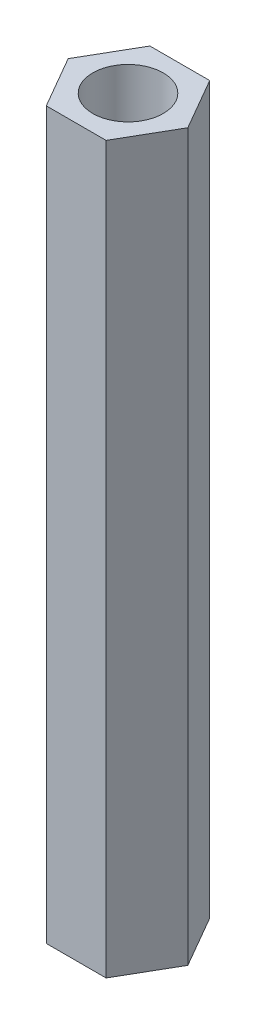
ISO-10303-21;
HEADER;
FILE_DESCRIPTION(('STEP AP214'),'2;1');
FILE_NAME('part.step','',(''),(''),'','','');
FILE_SCHEMA(('AUTOMOTIVE_DESIGN { 1 0 10303 214 1 1 1 1 }'));
ENDSEC;
DATA;
#1=APPLICATION_CONTEXT('core data for automotive mechanical design processes');
#2=APPLICATION_PROTOCOL_DEFINITION('international standard','automotive_design',2000,#1);
#3=PRODUCT_CONTEXT('',#1,'mechanical');
#4=PRODUCT('Part','Part','',(#3));
#5=PRODUCT_RELATED_PRODUCT_CATEGORY('part','',(#4));
#6=PRODUCT_DEFINITION_FORMATION('','',#4);
#7=PRODUCT_DEFINITION_CONTEXT('part definition',#1,'design');
#8=PRODUCT_DEFINITION('design','',#6,#7);
#9=PRODUCT_DEFINITION_SHAPE('','',#8);
#10=(LENGTH_UNIT() NAMED_UNIT(*) SI_UNIT(.MILLI.,.METRE.));
#11=(NAMED_UNIT(*) PLANE_ANGLE_UNIT() SI_UNIT($,.RADIAN.));
#12=(NAMED_UNIT(*) SI_UNIT($,.STERADIAN.) SOLID_ANGLE_UNIT());
#13=UNCERTAINTY_MEASURE_WITH_UNIT(LENGTH_MEASURE(1.E-05),#10,'distance_accuracy_value','');
#14=(GEOMETRIC_REPRESENTATION_CONTEXT(3) GLOBAL_UNCERTAINTY_ASSIGNED_CONTEXT((#13)) GLOBAL_UNIT_ASSIGNED_CONTEXT((#10,
#11,#12)) REPRESENTATION_CONTEXT('',''));
#15=CARTESIAN_POINT('',(0.,0.,0.));
#16=DIRECTION('',(0.,0.,1.));
#17=DIRECTION('',(1.,0.,0.));
#18=AXIS2_PLACEMENT_3D('',#15,#16,#17);
#19=CARTESIAN_POINT('',(-2.88675134594813,35.,0.));
#20=DIRECTION('',(0.866025403784439,0.,0.5));
#21=DIRECTION('',(0.5,0.,-0.866025403784439));
#22=AXIS2_PLACEMENT_3D('',#19,#20,#21);
#23=PLANE('',#22);
#24=DIRECTION('',(-0.5,0.,0.866025403784439));
#25=VECTOR('',#24,1.);
#26=CARTESIAN_POINT('',(-2.88675134594813,0.,0.));
#27=LINE('',#26,#25);
#28=CARTESIAN_POINT('',(-1.44337567297406,0.,-2.5));
#29=VERTEX_POINT('',#28);
#30=CARTESIAN_POINT('',(-2.88675134594813,0.,0.));
#31=VERTEX_POINT('',#30);
#32=EDGE_CURVE('E130',#29,#31,#27,.T.);
#33=ORIENTED_EDGE('',*,*,#32,.T.);
#34=DIRECTION('',(0.,-1.,0.));
#35=VECTOR('',#34,1.);
#36=CARTESIAN_POINT('',(-2.88675134594813,35.,0.));
#37=LINE('',#36,#35);
#38=CARTESIAN_POINT('',(-2.88675134594813,35.,0.));
#39=VERTEX_POINT('',#38);
#40=EDGE_CURVE('E11',#39,#31,#37,.T.);
#41=ORIENTED_EDGE('',*,*,#40,.F.);
#42=DIRECTION('',(-0.5,0.,0.866025403784439));
#43=VECTOR('',#42,1.);
#44=CARTESIAN_POINT('',(-2.88675134594813,35.,0.));
#45=LINE('',#44,#43);
#46=CARTESIAN_POINT('',(-1.44337567297406,35.,-2.5));
#47=VERTEX_POINT('',#46);
#48=EDGE_CURVE('E141',#47,#39,#45,.T.);
#49=ORIENTED_EDGE('',*,*,#48,.F.);
#50=DIRECTION('',(0.,-1.,0.));
#51=VECTOR('',#50,1.);
#52=CARTESIAN_POINT('',(-1.44337567297406,35.,-2.5));
#53=LINE('',#52,#51);
#54=EDGE_CURVE('E126',#47,#29,#53,.T.);
#55=ORIENTED_EDGE('',*,*,#54,.T.);
#56=EDGE_LOOP('',(#33,#41,#49,#55));
#57=FACE_BOUND('',#56,.T.);
#58=ADVANCED_FACE('F43',(#57),#23,.F.);
#59=CARTESIAN_POINT('',(-1.44337567297406,35.,2.5));
#60=DIRECTION('',(0.866025403784439,0.,-0.5));
#61=DIRECTION('',(-0.5,0.,-0.866025403784439));
#62=AXIS2_PLACEMENT_3D('',#59,#60,#61);
#63=PLANE('',#62);
#64=DIRECTION('',(0.5,0.,0.866025403784439));
#65=VECTOR('',#64,1.);
#66=CARTESIAN_POINT('',(-1.44337567297406,0.,2.5));
#67=LINE('',#66,#65);
#68=CARTESIAN_POINT('',(-1.44337567297406,0.,2.5));
#69=VERTEX_POINT('',#68);
#70=EDGE_CURVE('E133',#31,#69,#67,.T.);
#71=ORIENTED_EDGE('',*,*,#70,.T.);
#72=DIRECTION('',(0.,-1.,0.));
#73=VECTOR('',#72,1.);
#74=CARTESIAN_POINT('',(-1.44337567297406,35.,2.5));
#75=LINE('',#74,#73);
#76=CARTESIAN_POINT('',(-1.44337567297406,35.,2.5));
#77=VERTEX_POINT('',#76);
#78=EDGE_CURVE('E51',#77,#69,#75,.T.);
#79=ORIENTED_EDGE('',*,*,#78,.F.);
#80=DIRECTION('',(0.5,0.,0.866025403784439));
#81=VECTOR('',#80,1.);
#82=CARTESIAN_POINT('',(-1.44337567297406,35.,2.5));
#83=LINE('',#82,#81);
#84=EDGE_CURVE('E97',#39,#77,#83,.T.);
#85=ORIENTED_EDGE('',*,*,#84,.F.);
#86=ORIENTED_EDGE('',*,*,#40,.T.);
#87=EDGE_LOOP('',(#71,#79,#85,#86));
#88=FACE_BOUND('',#87,.T.);
#89=ADVANCED_FACE('F166',(#88),#63,.F.);
#90=CARTESIAN_POINT('',(1.44337567297406,35.,2.5));
#91=DIRECTION('',(0.,0.,-1.));
#92=DIRECTION('',(-1.,0.,0.));
#93=AXIS2_PLACEMENT_3D('',#90,#91,#92);
#94=PLANE('',#93);
#95=DIRECTION('',(1.,0.,0.));
#96=VECTOR('',#95,1.);
#97=CARTESIAN_POINT('',(1.44337567297406,0.,2.5));
#98=LINE('',#97,#96);
#99=CARTESIAN_POINT('',(1.44337567297406,0.,2.5));
#100=VERTEX_POINT('',#99);
#101=EDGE_CURVE('E136',#69,#100,#98,.T.);
#102=ORIENTED_EDGE('',*,*,#101,.T.);
#103=DIRECTION('',(0.,-1.,0.));
#104=VECTOR('',#103,1.);
#105=CARTESIAN_POINT('',(1.44337567297406,35.,2.5));
#106=LINE('',#105,#104);
#107=CARTESIAN_POINT('',(1.44337567297406,35.,2.5));
#108=VERTEX_POINT('',#107);
#109=EDGE_CURVE('E121',#108,#100,#106,.T.);
#110=ORIENTED_EDGE('',*,*,#109,.F.);
#111=DIRECTION('',(1.,0.,0.));
#112=VECTOR('',#111,1.);
#113=CARTESIAN_POINT('',(1.44337567297406,35.,2.5));
#114=LINE('',#113,#112);
#115=EDGE_CURVE('E112',#77,#108,#114,.T.);
#116=ORIENTED_EDGE('',*,*,#115,.F.);
#117=ORIENTED_EDGE('',*,*,#78,.T.);
#118=EDGE_LOOP('',(#102,#110,#116,#117));
#119=FACE_BOUND('',#118,.T.);
#120=ADVANCED_FACE('F147',(#119),#94,.F.);
#121=CARTESIAN_POINT('',(2.88675134594813,35.,0.));
#122=DIRECTION('',(-0.866025403784439,0.,-0.5));
#123=DIRECTION('',(-0.5,0.,0.866025403784439));
#124=AXIS2_PLACEMENT_3D('',#121,#122,#123);
#125=PLANE('',#124);
#126=DIRECTION('',(0.5,0.,-0.866025403784439));
#127=VECTOR('',#126,1.);
#128=CARTESIAN_POINT('',(2.88675134594813,0.,0.));
#129=LINE('',#128,#127);
#130=CARTESIAN_POINT('',(2.88675134594813,0.,0.));
#131=VERTEX_POINT('',#130);
#132=EDGE_CURVE('E120',#100,#131,#129,.T.);
#133=ORIENTED_EDGE('',*,*,#132,.T.);
#134=DIRECTION('',(0.,-1.,0.));
#135=VECTOR('',#134,1.);
#136=CARTESIAN_POINT('',(2.88675134594813,35.,0.));
#137=LINE('',#136,#135);
#138=CARTESIAN_POINT('',(2.88675134594813,35.,0.));
#139=VERTEX_POINT('',#138);
#140=EDGE_CURVE('E117',#139,#131,#137,.T.);
#141=ORIENTED_EDGE('',*,*,#140,.F.);
#142=DIRECTION('',(0.5,0.,-0.866025403784439));
#143=VECTOR('',#142,1.);
#144=CARTESIAN_POINT('',(2.88675134594813,35.,0.));
#145=LINE('',#144,#143);
#146=EDGE_CURVE('E106',#108,#139,#145,.T.);
#147=ORIENTED_EDGE('',*,*,#146,.F.);
#148=ORIENTED_EDGE('',*,*,#109,.T.);
#149=EDGE_LOOP('',(#133,#141,#147,#148));
#150=FACE_BOUND('',#149,.T.);
#151=ADVANCED_FACE('F118',(#150),#125,.F.);
#152=CARTESIAN_POINT('',(1.44337567297406,35.,-2.5));
#153=DIRECTION('',(-0.866025403784439,0.,0.5));
#154=DIRECTION('',(0.5,0.,0.866025403784439));
#155=AXIS2_PLACEMENT_3D('',#152,#153,#154);
#156=PLANE('',#155);
#157=DIRECTION('',(-0.5,0.,-0.866025403784439));
#158=VECTOR('',#157,1.);
#159=CARTESIAN_POINT('',(1.44337567297406,0.,-2.5));
#160=LINE('',#159,#158);
#161=CARTESIAN_POINT('',(1.44337567297406,0.,-2.5));
#162=VERTEX_POINT('',#161);
#163=EDGE_CURVE('E83',#131,#162,#160,.T.);
#164=ORIENTED_EDGE('',*,*,#163,.T.);
#165=DIRECTION('',(0.,-1.,0.));
#166=VECTOR('',#165,1.);
#167=CARTESIAN_POINT('',(1.44337567297406,35.,-2.5));
#168=LINE('',#167,#166);
#169=CARTESIAN_POINT('',(1.44337567297406,35.,-2.5));
#170=VERTEX_POINT('',#169);
#171=EDGE_CURVE('E122',#170,#162,#168,.T.);
#172=ORIENTED_EDGE('',*,*,#171,.F.);
#173=DIRECTION('',(-0.5,0.,-0.866025403784439));
#174=VECTOR('',#173,1.);
#175=CARTESIAN_POINT('',(1.44337567297406,35.,-2.5));
#176=LINE('',#175,#174);
#177=EDGE_CURVE('E110',#139,#170,#176,.T.);
#178=ORIENTED_EDGE('',*,*,#177,.F.);
#179=ORIENTED_EDGE('',*,*,#140,.T.);
#180=EDGE_LOOP('',(#164,#172,#178,#179));
#181=FACE_BOUND('',#180,.T.);
#182=ADVANCED_FACE('F124',(#181),#156,.F.);
#183=CARTESIAN_POINT('',(-1.44337567297406,35.,-2.5));
#184=DIRECTION('',(0.,0.,1.));
#185=DIRECTION('',(1.,0.,0.));
#186=AXIS2_PLACEMENT_3D('',#183,#184,#185);
#187=PLANE('',#186);
#188=DIRECTION('',(-1.,0.,0.));
#189=VECTOR('',#188,1.);
#190=CARTESIAN_POINT('',(-1.44337567297406,0.,-2.5));
#191=LINE('',#190,#189);
#192=EDGE_CURVE('E89',#162,#29,#191,.T.);
#193=ORIENTED_EDGE('',*,*,#192,.T.);
#194=ORIENTED_EDGE('',*,*,#54,.F.);
#195=DIRECTION('',(-1.,0.,0.));
#196=VECTOR('',#195,1.);
#197=CARTESIAN_POINT('',(-1.44337567297406,35.,-2.5));
#198=LINE('',#197,#196);
#199=EDGE_CURVE('E59',#170,#47,#198,.T.);
#200=ORIENTED_EDGE('',*,*,#199,.F.);
#201=ORIENTED_EDGE('',*,*,#171,.T.);
#202=EDGE_LOOP('',(#193,#194,#200,#201));
#203=FACE_BOUND('',#202,.T.);
#204=ADVANCED_FACE('F154',(#203),#187,.F.);
#205=CARTESIAN_POINT('',(0.,35.,0.));
#206=DIRECTION('',(0.,-1.,0.));
#207=DIRECTION('',(0.,0.,-1.));
#208=AXIS2_PLACEMENT_3D('',#205,#206,#207);
#209=PLANE('',#208);
#210=CARTESIAN_POINT('',(0.,35.,0.));
#211=DIRECTION('',(0.,1.,0.));
#212=DIRECTION('',(0.,0.,1.));
#213=AXIS2_PLACEMENT_3D('',#210,#211,#212);
#214=CIRCLE('',#213,1.7);
#215=CARTESIAN_POINT('',(0.,35.,1.7));
#216=VERTEX_POINT('',#215);
#217=EDGE_CURVE('E255',#216,#216,#214,.T.);
#218=ORIENTED_EDGE('',*,*,#217,.F.);
#219=EDGE_LOOP('',(#218));
#220=FACE_BOUND('',#219,.T.);
#221=ORIENTED_EDGE('',*,*,#48,.T.);
#222=ORIENTED_EDGE('',*,*,#84,.T.);
#223=ORIENTED_EDGE('',*,*,#115,.T.);
#224=ORIENTED_EDGE('',*,*,#146,.T.);
#225=ORIENTED_EDGE('',*,*,#177,.T.);
#226=ORIENTED_EDGE('',*,*,#199,.T.);
#227=EDGE_LOOP('',(#221,#222,#223,#224,#225,#226));
#228=FACE_BOUND('',#227,.T.);
#229=ADVANCED_FACE('F108',(#220,#228),#209,.F.);
#230=CARTESIAN_POINT('',(0.,0.,0.));
#231=DIRECTION('',(0.,-1.,0.));
#232=DIRECTION('',(0.,0.,-1.));
#233=AXIS2_PLACEMENT_3D('',#230,#231,#232);
#234=PLANE('',#233);
#235=CARTESIAN_POINT('',(0.,0.,0.));
#236=DIRECTION('',(0.,-1.,0.));
#237=DIRECTION('',(0.,0.,-1.));
#238=AXIS2_PLACEMENT_3D('',#235,#236,#237);
#239=CIRCLE('',#238,1.69999999999999);
#240=CARTESIAN_POINT('',(0.,0.,-1.69999999999999));
#241=VERTEX_POINT('',#240);
#242=EDGE_CURVE('E253',#241,#241,#239,.T.);
#243=ORIENTED_EDGE('',*,*,#242,.F.);
#244=EDGE_LOOP('',(#243));
#245=FACE_BOUND('',#244,.T.);
#246=ORIENTED_EDGE('',*,*,#32,.F.);
#247=ORIENTED_EDGE('',*,*,#192,.F.);
#248=ORIENTED_EDGE('',*,*,#163,.F.);
#249=ORIENTED_EDGE('',*,*,#132,.F.);
#250=ORIENTED_EDGE('',*,*,#101,.F.);
#251=ORIENTED_EDGE('',*,*,#70,.F.);
#252=EDGE_LOOP('',(#246,#247,#248,#249,#250,#251));
#253=FACE_BOUND('',#252,.T.);
#254=ADVANCED_FACE('F150',(#245,#253),#234,.T.);
#255=CARTESIAN_POINT('',(0.,30.,0.));
#256=DIRECTION('',(0.,1.,0.));
#257=DIRECTION('',(0.,0.,1.));
#258=AXIS2_PLACEMENT_3D('',#255,#256,#257);
#259=CONICAL_SURFACE('',#258,1.7,1.02974425867665);
#260=CARTESIAN_POINT('',(0.,28.9785369476532,0.));
#261=VERTEX_POINT('',#260);
#262=VERTEX_LOOP('',#261);
#263=FACE_BOUND('',#262,.T.);
#264=CARTESIAN_POINT('',(0.,30.,0.));
#265=DIRECTION('',(0.,1.,0.));
#266=DIRECTION('',(0.,0.,1.));
#267=AXIS2_PLACEMENT_3D('',#264,#265,#266);
#268=CIRCLE('',#267,1.7);
#269=CARTESIAN_POINT('',(0.,30.,1.7));
#270=VERTEX_POINT('',#269);
#271=EDGE_CURVE('E134',#270,#270,#268,.T.);
#272=ORIENTED_EDGE('',*,*,#271,.T.);
#273=EDGE_LOOP('',(#272));
#274=FACE_BOUND('',#273,.T.);
#275=ADVANCED_FACE('F206',(#263,#274),#259,.F.);
#276=CARTESIAN_POINT('',(0.,35.,0.));
#277=DIRECTION('',(0.,1.,0.));
#278=DIRECTION('',(0.,0.,1.));
#279=AXIS2_PLACEMENT_3D('',#276,#277,#278);
#280=CYLINDRICAL_SURFACE('',#279,1.7);
#281=ORIENTED_EDGE('',*,*,#271,.F.);
#282=EDGE_LOOP('',(#281));
#283=FACE_BOUND('',#282,.T.);
#284=ORIENTED_EDGE('',*,*,#217,.T.);
#285=EDGE_LOOP('',(#284));
#286=FACE_BOUND('',#285,.T.);
#287=ADVANCED_FACE('F216',(#283,#286),#280,.F.);
#288=CARTESIAN_POINT('',(0.,5.,0.));
#289=DIRECTION('',(0.,-1.,0.));
#290=DIRECTION('',(0.,0.,-1.));
#291=AXIS2_PLACEMENT_3D('',#288,#289,#290);
#292=CONICAL_SURFACE('',#291,1.69999999999999,1.02974425867665);
#293=CARTESIAN_POINT('',(0.,6.02146305234685,0.));
#294=VERTEX_POINT('',#293);
#295=VERTEX_LOOP('',#294);
#296=FACE_BOUND('',#295,.T.);
#297=CARTESIAN_POINT('',(0.,5.,0.));
#298=DIRECTION('',(0.,-1.,0.));
#299=DIRECTION('',(0.,0.,-1.));
#300=AXIS2_PLACEMENT_3D('',#297,#298,#299);
#301=CIRCLE('',#300,1.69999999999999);
#302=CARTESIAN_POINT('',(0.,5.,-1.69999999999999));
#303=VERTEX_POINT('',#302);
#304=EDGE_CURVE('E250',#303,#303,#301,.T.);
#305=ORIENTED_EDGE('',*,*,#304,.T.);
#306=EDGE_LOOP('',(#305));
#307=FACE_BOUND('',#306,.T.);
#308=ADVANCED_FACE('F225',(#296,#307),#292,.F.);
#309=CARTESIAN_POINT('',(0.,0.,0.));
#310=DIRECTION('',(0.,-1.,0.));
#311=DIRECTION('',(0.,0.,-1.));
#312=AXIS2_PLACEMENT_3D('',#309,#310,#311);
#313=CYLINDRICAL_SURFACE('',#312,1.69999999999999);
#314=ORIENTED_EDGE('',*,*,#304,.F.);
#315=EDGE_LOOP('',(#314));
#316=FACE_BOUND('',#315,.T.);
#317=ORIENTED_EDGE('',*,*,#242,.T.);
#318=EDGE_LOOP('',(#317));
#319=FACE_BOUND('',#318,.T.);
#320=ADVANCED_FACE('F234',(#316,#319),#313,.F.);
#321=CLOSED_SHELL('',(#58,#89,#120,#151,#182,#204,#229,#254,#275,#287,#308,#320));
#322=MANIFOLD_SOLID_BREP('B2',#321);
#323=ADVANCED_BREP_SHAPE_REPRESENTATION('',(#18,#322),#14);
#324=SHAPE_DEFINITION_REPRESENTATION(#9,#323);
ENDSEC;
END-ISO-10303-21;
